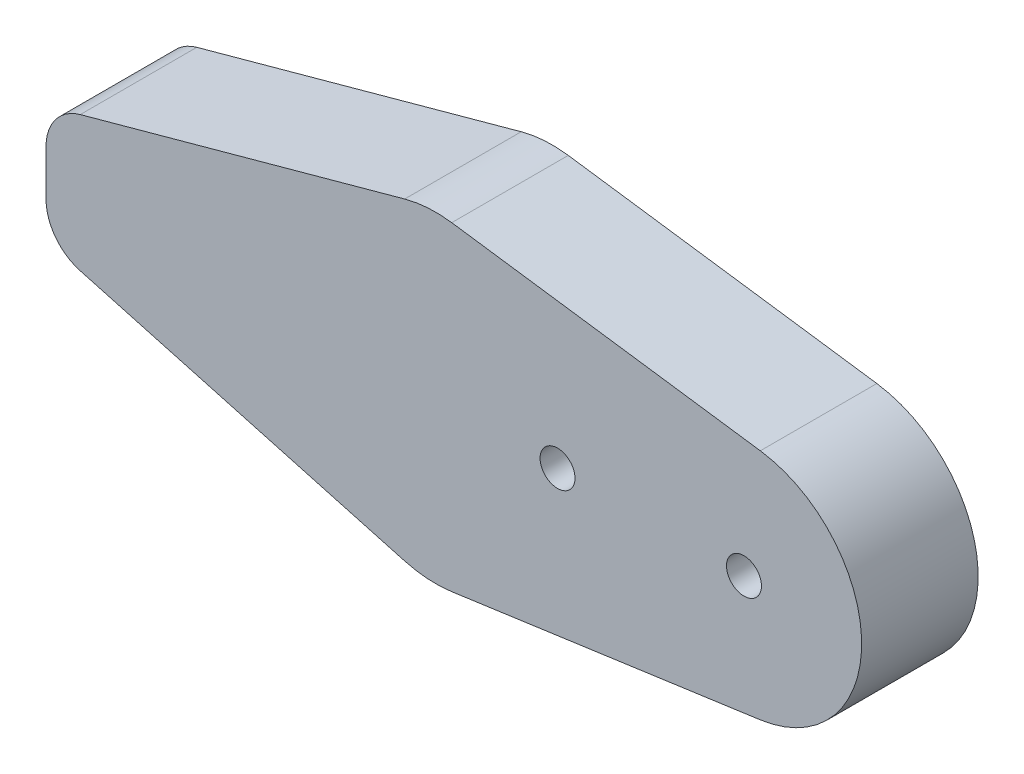
ISO-10303-21;
HEADER;
FILE_DESCRIPTION(('STEP AP214'),'2;1');
FILE_NAME('part.step','',(''),(''),'','','');
FILE_SCHEMA(('AUTOMOTIVE_DESIGN { 1 0 10303 214 1 1 1 1 }'));
ENDSEC;
DATA;
#1=APPLICATION_CONTEXT('core data for automotive mechanical design processes');
#2=APPLICATION_PROTOCOL_DEFINITION('international standard','automotive_design',2000,#1);
#3=PRODUCT_CONTEXT('',#1,'mechanical');
#4=PRODUCT('Part','Part','',(#3));
#5=PRODUCT_RELATED_PRODUCT_CATEGORY('part','',(#4));
#6=PRODUCT_DEFINITION_FORMATION('','',#4);
#7=PRODUCT_DEFINITION_CONTEXT('part definition',#1,'design');
#8=PRODUCT_DEFINITION('design','',#6,#7);
#9=PRODUCT_DEFINITION_SHAPE('','',#8);
#10=(LENGTH_UNIT() NAMED_UNIT(*) SI_UNIT(.MILLI.,.METRE.));
#11=(NAMED_UNIT(*) PLANE_ANGLE_UNIT() SI_UNIT($,.RADIAN.));
#12=(NAMED_UNIT(*) SI_UNIT($,.STERADIAN.) SOLID_ANGLE_UNIT());
#13=UNCERTAINTY_MEASURE_WITH_UNIT(LENGTH_MEASURE(1.E-05),#10,'distance_accuracy_value','');
#14=(GEOMETRIC_REPRESENTATION_CONTEXT(3) GLOBAL_UNCERTAINTY_ASSIGNED_CONTEXT((#13)) GLOBAL_UNIT_ASSIGNED_CONTEXT((#10,
#11,#12)) REPRESENTATION_CONTEXT('',''));
#15=CARTESIAN_POINT('',(0.,0.,0.));
#16=DIRECTION('',(0.,0.,1.));
#17=DIRECTION('',(1.,0.,0.));
#18=AXIS2_PLACEMENT_3D('',#15,#16,#17);
#19=CARTESIAN_POINT('',(18.5921017189423,0.,5.));
#20=DIRECTION('',(0.,0.,-1.));
#21=DIRECTION('',(-1.,0.,0.));
#22=AXIS2_PLACEMENT_3D('',#19,#20,#21);
#23=CYLINDRICAL_SURFACE('',#22,5.04890608443004);
#24=CARTESIAN_POINT('',(18.5921017189423,0.,0.));
#25=DIRECTION('',(0.,0.,1.));
#26=DIRECTION('',(1.,0.,0.));
#27=AXIS2_PLACEMENT_3D('',#24,#25,#26);
#28=CIRCLE('',#27,5.04890608443004);
#29=CARTESIAN_POINT('',(19.2931385577709,-5.,0.));
#30=VERTEX_POINT('',#29);
#31=CARTESIAN_POINT('',(19.2931385577709,5.,0.));
#32=VERTEX_POINT('',#31);
#33=EDGE_CURVE('E158',#30,#32,#28,.T.);
#34=ORIENTED_EDGE('',*,*,#33,.T.);
#35=DIRECTION('',(0.,0.,-1.));
#36=VECTOR('',#35,1.);
#37=CARTESIAN_POINT('',(19.2931385577709,5.,5.));
#38=LINE('',#37,#36);
#39=CARTESIAN_POINT('',(19.2931385577709,5.,5.));
#40=VERTEX_POINT('',#39);
#41=EDGE_CURVE('E11',#40,#32,#38,.T.);
#42=ORIENTED_EDGE('',*,*,#41,.F.);
#43=CARTESIAN_POINT('',(18.5921017189423,0.,5.));
#44=DIRECTION('',(0.,0.,1.));
#45=DIRECTION('',(1.,0.,0.));
#46=AXIS2_PLACEMENT_3D('',#43,#44,#45);
#47=CIRCLE('',#46,5.04890608443004);
#48=CARTESIAN_POINT('',(19.2931385577709,-5.,5.));
#49=VERTEX_POINT('',#48);
#50=EDGE_CURVE('E178',#49,#40,#47,.T.);
#51=ORIENTED_EDGE('',*,*,#50,.F.);
#52=DIRECTION('',(0.,0.,-1.));
#53=VECTOR('',#52,1.);
#54=CARTESIAN_POINT('',(19.2931385577709,-5.,5.));
#55=LINE('',#54,#53);
#56=EDGE_CURVE('E154',#49,#30,#55,.T.);
#57=ORIENTED_EDGE('',*,*,#56,.T.);
#58=EDGE_LOOP('',(#34,#42,#51,#57));
#59=FACE_BOUND('',#58,.T.);
#60=ADVANCED_FACE('F36',(#59),#23,.T.);
#61=CARTESIAN_POINT('',(6.05109589484435,6.85663194561017,5.));
#62=DIRECTION('',(-0.138849253106614,-0.990313528591696,0.));
#63=DIRECTION('',(0.990313528591696,-0.138849253106614,0.));
#64=AXIS2_PLACEMENT_3D('',#61,#62,#63);
#65=PLANE('',#64);
#66=DIRECTION('',(-0.990313528591696,0.138849253106614,0.));
#67=VECTOR('',#66,1.);
#68=CARTESIAN_POINT('',(6.05109589484435,6.85663194561017,0.));
#69=LINE('',#68,#67);
#70=CARTESIAN_POINT('',(6.05109589484435,6.85663194561017,0.));
#71=VERTEX_POINT('',#70);
#72=EDGE_CURVE('E161',#32,#71,#69,.T.);
#73=ORIENTED_EDGE('',*,*,#72,.T.);
#74=DIRECTION('',(0.,0.,-1.));
#75=VECTOR('',#74,1.);
#76=CARTESIAN_POINT('',(6.05109589484435,6.85663194561017,5.));
#77=LINE('',#76,#75);
#78=CARTESIAN_POINT('',(6.05109589484435,6.85663194561017,5.));
#79=VERTEX_POINT('',#78);
#80=EDGE_CURVE('E44',#79,#71,#77,.T.);
#81=ORIENTED_EDGE('',*,*,#80,.F.);
#82=DIRECTION('',(-0.990313528591696,0.138849253106614,0.));
#83=VECTOR('',#82,1.);
#84=CARTESIAN_POINT('',(6.05109589484435,6.85663194561017,5.));
#85=LINE('',#84,#83);
#86=EDGE_CURVE('E108',#40,#79,#85,.T.);
#87=ORIENTED_EDGE('',*,*,#86,.F.);
#88=ORIENTED_EDGE('',*,*,#41,.T.);
#89=EDGE_LOOP('',(#73,#81,#87,#88));
#90=FACE_BOUND('',#89,.T.);
#91=ADVANCED_FACE('F268',(#90),#65,.F.);
#92=CARTESIAN_POINT('',(5.35684962931128,1.90506430265169,5.));
#93=DIRECTION('',(0.,0.,-1.));
#94=DIRECTION('',(-1.,0.,0.));
#95=AXIS2_PLACEMENT_3D('',#92,#93,#94);
#96=CYLINDRICAL_SURFACE('',#95,5.);
#97=CARTESIAN_POINT('',(5.35684962931128,1.90506430265169,0.));
#98=DIRECTION('',(0.,0.,1.));
#99=DIRECTION('',(-1.,0.,0.));
#100=AXIS2_PLACEMENT_3D('',#97,#98,#99);
#101=CIRCLE('',#100,5.);
#102=CARTESIAN_POINT('',(4.03286576113956,6.72658550625757,0.));
#103=VERTEX_POINT('',#102);
#104=EDGE_CURVE('E164',#71,#103,#101,.T.);
#105=ORIENTED_EDGE('',*,*,#104,.T.);
#106=DIRECTION('',(0.,0.,-1.));
#107=VECTOR('',#106,1.);
#108=CARTESIAN_POINT('',(4.03286576113956,6.72658550625757,5.));
#109=LINE('',#108,#107);
#110=CARTESIAN_POINT('',(4.03286576113956,6.72658550625757,5.));
#111=VERTEX_POINT('',#110);
#112=EDGE_CURVE('E191',#111,#103,#109,.T.);
#113=ORIENTED_EDGE('',*,*,#112,.F.);
#114=CARTESIAN_POINT('',(5.35684962931128,1.90506430265169,5.));
#115=DIRECTION('',(0.,0.,1.));
#116=DIRECTION('',(-1.,0.,0.));
#117=AXIS2_PLACEMENT_3D('',#114,#115,#116);
#118=CIRCLE('',#117,5.);
#119=EDGE_CURVE('E242',#79,#111,#118,.T.);
#120=ORIENTED_EDGE('',*,*,#119,.F.);
#121=ORIENTED_EDGE('',*,*,#80,.T.);
#122=EDGE_LOOP('',(#105,#113,#120,#121));
#123=FACE_BOUND('',#122,.T.);
#124=ADVANCED_FACE('F271',(#123),#96,.T.);
#125=CARTESIAN_POINT('',(-9.88858574389631,2.90377182653804,5.));
#126=DIRECTION('',(0.264796773634343,-0.964304240721175,0.));
#127=DIRECTION('',(0.964304240721175,0.264796773634343,0.));
#128=AXIS2_PLACEMENT_3D('',#125,#126,#127);
#129=PLANE('',#128);
#130=DIRECTION('',(-0.964304240721175,-0.264796773634343,0.));
#131=VECTOR('',#130,1.);
#132=CARTESIAN_POINT('',(-9.88858574389631,2.90377182653804,0.));
#133=LINE('',#132,#131);
#134=CARTESIAN_POINT('',(-9.88858574389631,2.90377182653804,0.));
#135=VERTEX_POINT('',#134);
#136=EDGE_CURVE('E166',#103,#135,#133,.T.);
#137=ORIENTED_EDGE('',*,*,#136,.T.);
#138=DIRECTION('',(0.,0.,-1.));
#139=VECTOR('',#138,1.);
#140=CARTESIAN_POINT('',(-9.88858574389631,2.90377182653804,5.));
#141=LINE('',#140,#139);
#142=CARTESIAN_POINT('',(-9.88858574389631,2.90377182653804,5.));
#143=VERTEX_POINT('',#142);
#144=EDGE_CURVE('E188',#143,#135,#141,.T.);
#145=ORIENTED_EDGE('',*,*,#144,.F.);
#146=DIRECTION('',(-0.964304240721175,-0.264796773634343,0.));
#147=VECTOR('',#146,1.);
#148=CARTESIAN_POINT('',(-9.88858574389631,2.90377182653804,5.));
#149=LINE('',#148,#147);
#150=EDGE_CURVE('E244',#111,#143,#149,.T.);
#151=ORIENTED_EDGE('',*,*,#150,.F.);
#152=ORIENTED_EDGE('',*,*,#112,.T.);
#153=EDGE_LOOP('',(#137,#145,#151,#152));
#154=FACE_BOUND('',#153,.T.);
#155=ADVANCED_FACE('F276',(#154),#129,.F.);
#156=CARTESIAN_POINT('',(-9.35899219662762,0.975163345095687,5.));
#157=DIRECTION('',(0.,0.,-1.));
#158=DIRECTION('',(-1.,0.,0.));
#159=AXIS2_PLACEMENT_3D('',#156,#157,#158);
#160=CYLINDRICAL_SURFACE('',#159,2.);
#161=CARTESIAN_POINT('',(-9.35899219662762,0.975163345095687,0.));
#162=DIRECTION('',(0.,0.,1.));
#163=DIRECTION('',(-1.,0.,0.));
#164=AXIS2_PLACEMENT_3D('',#161,#162,#163);
#165=CIRCLE('',#164,2.);
#166=CARTESIAN_POINT('',(-11.3589921966276,0.975163345095687,0.));
#167=VERTEX_POINT('',#166);
#168=EDGE_CURVE('E168',#135,#167,#165,.T.);
#169=ORIENTED_EDGE('',*,*,#168,.T.);
#170=DIRECTION('',(0.,0.,-1.));
#171=VECTOR('',#170,1.);
#172=CARTESIAN_POINT('',(-11.3589921966276,0.975163345095687,5.));
#173=LINE('',#172,#171);
#174=CARTESIAN_POINT('',(-11.3589921966276,0.975163345095687,5.));
#175=VERTEX_POINT('',#174);
#176=EDGE_CURVE('E185',#175,#167,#173,.T.);
#177=ORIENTED_EDGE('',*,*,#176,.F.);
#178=CARTESIAN_POINT('',(-9.35899219662762,0.975163345095687,5.));
#179=DIRECTION('',(0.,0.,1.));
#180=DIRECTION('',(-1.,0.,0.));
#181=AXIS2_PLACEMENT_3D('',#178,#179,#180);
#182=CIRCLE('',#181,2.);
#183=EDGE_CURVE('E246',#143,#175,#182,.T.);
#184=ORIENTED_EDGE('',*,*,#183,.F.);
#185=ORIENTED_EDGE('',*,*,#144,.T.);
#186=EDGE_LOOP('',(#169,#177,#184,#185));
#187=FACE_BOUND('',#186,.T.);
#188=ADVANCED_FACE('F279',(#187),#160,.T.);
#189=CARTESIAN_POINT('',(-11.3589921966276,-0.975163345095687,5.));
#190=DIRECTION('',(1.,0.,0.));
#191=DIRECTION('',(0.,0.,-1.));
#192=AXIS2_PLACEMENT_3D('',#189,#190,#191);
#193=PLANE('',#192);
#194=CARTESIAN_POINT('',(-11.3589921966276,0.00496564635896147,3.));
#195=DIRECTION('',(-1.,0.,0.));
#196=DIRECTION('',(0.,0.,1.));
#197=AXIS2_PLACEMENT_3D('',#194,#195,#196);
#198=CIRCLE('',#197,0.75);
#199=CARTESIAN_POINT('',(-11.3589921966276,-0.745034353641038,3.));
#200=VERTEX_POINT('',#199);
#201=CARTESIAN_POINT('',(-11.3589921966276,0.754965646358961,3.));
#202=VERTEX_POINT('',#201);
#203=EDGE_CURVE('E224',#200,#202,#198,.T.);
#204=ORIENTED_EDGE('',*,*,#203,.F.);
#205=DIRECTION('',(0.,0.,1.));
#206=VECTOR('',#205,1.);
#207=CARTESIAN_POINT('',(-11.3589921966276,-0.745034353641038,3.));
#208=LINE('',#207,#206);
#209=CARTESIAN_POINT('',(-11.3589921966276,-0.745034353641039,1.));
#210=VERTEX_POINT('',#209);
#211=EDGE_CURVE('E52',#210,#200,#208,.T.);
#212=ORIENTED_EDGE('',*,*,#211,.F.);
#213=DIRECTION('',(0.,-1.,0.));
#214=VECTOR('',#213,1.);
#215=CARTESIAN_POINT('',(-11.3589921966276,-0.745034353641039,1.));
#216=LINE('',#215,#214);
#217=CARTESIAN_POINT('',(-11.3589921966276,0.754965646358961,1.));
#218=VERTEX_POINT('',#217);
#219=EDGE_CURVE('E213',#218,#210,#216,.T.);
#220=ORIENTED_EDGE('',*,*,#219,.F.);
#221=DIRECTION('',(0.,0.,-1.));
#222=VECTOR('',#221,1.);
#223=CARTESIAN_POINT('',(-11.3589921966276,0.754965646358961,1.));
#224=LINE('',#223,#222);
#225=EDGE_CURVE('E227',#202,#218,#224,.T.);
#226=ORIENTED_EDGE('',*,*,#225,.F.);
#227=EDGE_LOOP('',(#204,#212,#220,#226));
#228=FACE_BOUND('',#227,.T.);
#229=DIRECTION('',(0.,-1.,0.));
#230=VECTOR('',#229,1.);
#231=CARTESIAN_POINT('',(-11.3589921966276,-0.975163345095687,0.));
#232=LINE('',#231,#230);
#233=CARTESIAN_POINT('',(-11.3589921966276,-0.975163345095687,0.));
#234=VERTEX_POINT('',#233);
#235=EDGE_CURVE('E170',#167,#234,#232,.T.);
#236=ORIENTED_EDGE('',*,*,#235,.T.);
#237=DIRECTION('',(0.,0.,-1.));
#238=VECTOR('',#237,1.);
#239=CARTESIAN_POINT('',(-11.3589921966276,-0.975163345095687,5.));
#240=LINE('',#239,#238);
#241=CARTESIAN_POINT('',(-11.3589921966276,-0.975163345095687,5.));
#242=VERTEX_POINT('',#241);
#243=EDGE_CURVE('E182',#242,#234,#240,.T.);
#244=ORIENTED_EDGE('',*,*,#243,.F.);
#245=DIRECTION('',(0.,-1.,0.));
#246=VECTOR('',#245,1.);
#247=CARTESIAN_POINT('',(-11.3589921966276,-0.975163345095687,5.));
#248=LINE('',#247,#246);
#249=EDGE_CURVE('E248',#175,#242,#248,.T.);
#250=ORIENTED_EDGE('',*,*,#249,.F.);
#251=ORIENTED_EDGE('',*,*,#176,.T.);
#252=EDGE_LOOP('',(#236,#244,#250,#251));
#253=FACE_BOUND('',#252,.T.);
#254=ADVANCED_FACE('F254',(#228,#253),#193,.F.);
#255=CARTESIAN_POINT('',(-9.35899219662762,-0.975163345095687,5.));
#256=DIRECTION('',(0.,0.,-1.));
#257=DIRECTION('',(-1.,0.,0.));
#258=AXIS2_PLACEMENT_3D('',#255,#256,#257);
#259=CYLINDRICAL_SURFACE('',#258,2.);
#260=CARTESIAN_POINT('',(-9.35899219662762,-0.975163345095687,0.));
#261=DIRECTION('',(0.,0.,1.));
#262=DIRECTION('',(-1.,0.,0.));
#263=AXIS2_PLACEMENT_3D('',#260,#261,#262);
#264=CIRCLE('',#263,2.);
#265=CARTESIAN_POINT('',(-9.88858574389631,-2.90377182653804,0.));
#266=VERTEX_POINT('',#265);
#267=EDGE_CURVE('E172',#234,#266,#264,.T.);
#268=ORIENTED_EDGE('',*,*,#267,.T.);
#269=DIRECTION('',(0.,0.,-1.));
#270=VECTOR('',#269,1.);
#271=CARTESIAN_POINT('',(-9.88858574389631,-2.90377182653804,5.));
#272=LINE('',#271,#270);
#273=CARTESIAN_POINT('',(-9.88858574389631,-2.90377182653804,5.));
#274=VERTEX_POINT('',#273);
#275=EDGE_CURVE('E149',#274,#266,#272,.T.);
#276=ORIENTED_EDGE('',*,*,#275,.F.);
#277=CARTESIAN_POINT('',(-9.35899219662762,-0.975163345095687,5.));
#278=DIRECTION('',(0.,0.,1.));
#279=DIRECTION('',(-1.,0.,0.));
#280=AXIS2_PLACEMENT_3D('',#277,#278,#279);
#281=CIRCLE('',#280,2.);
#282=EDGE_CURVE('E137',#242,#274,#281,.T.);
#283=ORIENTED_EDGE('',*,*,#282,.F.);
#284=ORIENTED_EDGE('',*,*,#243,.T.);
#285=EDGE_LOOP('',(#268,#276,#283,#284));
#286=FACE_BOUND('',#285,.T.);
#287=ADVANCED_FACE('F258',(#286),#259,.T.);
#288=CARTESIAN_POINT('',(-9.88858574389631,-2.90377182653804,5.));
#289=DIRECTION('',(0.264796773634343,0.964304240721175,0.));
#290=DIRECTION('',(-0.964304240721175,0.264796773634343,0.));
#291=AXIS2_PLACEMENT_3D('',#288,#289,#290);
#292=PLANE('',#291);
#293=DIRECTION('',(0.964304240721175,-0.264796773634343,0.));
#294=VECTOR('',#293,1.);
#295=CARTESIAN_POINT('',(-9.88858574389631,-2.90377182653804,0.));
#296=LINE('',#295,#294);
#297=CARTESIAN_POINT('',(4.03286576113956,-6.72658550625757,0.));
#298=VERTEX_POINT('',#297);
#299=EDGE_CURVE('E146',#266,#298,#296,.T.);
#300=ORIENTED_EDGE('',*,*,#299,.T.);
#301=DIRECTION('',(0.,0.,-1.));
#302=VECTOR('',#301,1.);
#303=CARTESIAN_POINT('',(4.03286576113956,-6.72658550625757,5.));
#304=LINE('',#303,#302);
#305=CARTESIAN_POINT('',(4.03286576113956,-6.72658550625757,5.));
#306=VERTEX_POINT('',#305);
#307=EDGE_CURVE('E143',#306,#298,#304,.T.);
#308=ORIENTED_EDGE('',*,*,#307,.F.);
#309=DIRECTION('',(0.964304240721175,-0.264796773634343,0.));
#310=VECTOR('',#309,1.);
#311=CARTESIAN_POINT('',(-9.88858574389631,-2.90377182653804,5.));
#312=LINE('',#311,#310);
#313=EDGE_CURVE('E130',#274,#306,#312,.T.);
#314=ORIENTED_EDGE('',*,*,#313,.F.);
#315=ORIENTED_EDGE('',*,*,#275,.T.);
#316=EDGE_LOOP('',(#300,#308,#314,#315));
#317=FACE_BOUND('',#316,.T.);
#318=ADVANCED_FACE('F144',(#317),#292,.F.);
#319=CARTESIAN_POINT('',(5.35684962931128,-1.90506430265169,5.));
#320=DIRECTION('',(0.,0.,-1.));
#321=DIRECTION('',(-1.,0.,0.));
#322=AXIS2_PLACEMENT_3D('',#319,#320,#321);
#323=CYLINDRICAL_SURFACE('',#322,5.);
#324=CARTESIAN_POINT('',(5.35684962931128,-1.90506430265169,0.));
#325=DIRECTION('',(0.,0.,1.));
#326=DIRECTION('',(-1.,0.,0.));
#327=AXIS2_PLACEMENT_3D('',#324,#325,#326);
#328=CIRCLE('',#327,5.);
#329=CARTESIAN_POINT('',(6.05109589484435,-6.85663194561017,0.));
#330=VERTEX_POINT('',#329);
#331=EDGE_CURVE('E175',#298,#330,#328,.T.);
#332=ORIENTED_EDGE('',*,*,#331,.T.);
#333=DIRECTION('',(0.,0.,-1.));
#334=VECTOR('',#333,1.);
#335=CARTESIAN_POINT('',(6.05109589484435,-6.85663194561017,5.));
#336=LINE('',#335,#334);
#337=CARTESIAN_POINT('',(6.05109589484435,-6.85663194561017,5.));
#338=VERTEX_POINT('',#337);
#339=EDGE_CURVE('E150',#338,#330,#336,.T.);
#340=ORIENTED_EDGE('',*,*,#339,.F.);
#341=CARTESIAN_POINT('',(5.35684962931128,-1.90506430265169,5.));
#342=DIRECTION('',(0.,0.,1.));
#343=DIRECTION('',(-1.,0.,0.));
#344=AXIS2_PLACEMENT_3D('',#341,#342,#343);
#345=CIRCLE('',#344,5.);
#346=EDGE_CURVE('E134',#306,#338,#345,.T.);
#347=ORIENTED_EDGE('',*,*,#346,.F.);
#348=ORIENTED_EDGE('',*,*,#307,.T.);
#349=EDGE_LOOP('',(#332,#340,#347,#348));
#350=FACE_BOUND('',#349,.T.);
#351=ADVANCED_FACE('F152',(#350),#323,.T.);
#352=CARTESIAN_POINT('',(6.05109589484435,-6.85663194561017,5.));
#353=DIRECTION('',(-0.138849253106614,0.990313528591696,0.));
#354=DIRECTION('',(-0.990313528591696,-0.138849253106614,0.));
#355=AXIS2_PLACEMENT_3D('',#352,#353,#354);
#356=PLANE('',#355);
#357=DIRECTION('',(0.990313528591696,0.138849253106614,0.));
#358=VECTOR('',#357,1.);
#359=CARTESIAN_POINT('',(6.05109589484435,-6.85663194561017,0.));
#360=LINE('',#359,#358);
#361=EDGE_CURVE('E100',#330,#30,#360,.T.);
#362=ORIENTED_EDGE('',*,*,#361,.T.);
#363=ORIENTED_EDGE('',*,*,#56,.F.);
#364=DIRECTION('',(0.990313528591696,0.138849253106614,0.));
#365=VECTOR('',#364,1.);
#366=CARTESIAN_POINT('',(6.05109589484435,-6.85663194561017,5.));
#367=LINE('',#366,#365);
#368=EDGE_CURVE('E61',#338,#49,#367,.T.);
#369=ORIENTED_EDGE('',*,*,#368,.F.);
#370=ORIENTED_EDGE('',*,*,#339,.T.);
#371=EDGE_LOOP('',(#362,#363,#369,#370));
#372=FACE_BOUND('',#371,.T.);
#373=ADVANCED_FACE('F262',(#372),#356,.F.);
#374=CARTESIAN_POINT('',(18.5921017189423,0.,5.));
#375=DIRECTION('',(0.,0.,1.));
#376=DIRECTION('',(1.,0.,0.));
#377=AXIS2_PLACEMENT_3D('',#374,#375,#376);
#378=PLANE('',#377);
#379=CARTESIAN_POINT('',(18.5921017189423,0.,5.));
#380=DIRECTION('',(0.,0.,1.));
#381=DIRECTION('',(1.,0.,0.));
#382=AXIS2_PLACEMENT_3D('',#379,#380,#381);
#383=CIRCLE('',#382,0.750000000000002);
#384=CARTESIAN_POINT('',(19.3421017189423,0.,5.));
#385=VERTEX_POINT('',#384);
#386=EDGE_CURVE('E197',#385,#385,#383,.T.);
#387=ORIENTED_EDGE('',*,*,#386,.F.);
#388=EDGE_LOOP('',(#387));
#389=FACE_BOUND('',#388,.T.);
#390=CARTESIAN_POINT('',(10.5921017189423,0.,5.));
#391=DIRECTION('',(0.,0.,1.));
#392=DIRECTION('',(1.,0.,0.));
#393=AXIS2_PLACEMENT_3D('',#390,#391,#392);
#394=CIRCLE('',#393,0.75);
#395=CARTESIAN_POINT('',(11.3421017189423,0.,5.));
#396=VERTEX_POINT('',#395);
#397=EDGE_CURVE('E202',#396,#396,#394,.T.);
#398=ORIENTED_EDGE('',*,*,#397,.F.);
#399=EDGE_LOOP('',(#398));
#400=FACE_BOUND('',#399,.T.);
#401=ORIENTED_EDGE('',*,*,#50,.T.);
#402=ORIENTED_EDGE('',*,*,#86,.T.);
#403=ORIENTED_EDGE('',*,*,#119,.T.);
#404=ORIENTED_EDGE('',*,*,#150,.T.);
#405=ORIENTED_EDGE('',*,*,#183,.T.);
#406=ORIENTED_EDGE('',*,*,#249,.T.);
#407=ORIENTED_EDGE('',*,*,#282,.T.);
#408=ORIENTED_EDGE('',*,*,#313,.T.);
#409=ORIENTED_EDGE('',*,*,#346,.T.);
#410=ORIENTED_EDGE('',*,*,#368,.T.);
#411=EDGE_LOOP('',(#401,#402,#403,#404,#405,#406,#407,#408,#409,#410));
#412=FACE_BOUND('',#411,.T.);
#413=ADVANCED_FACE('F132',(#389,#400,#412),#378,.T.);
#414=CARTESIAN_POINT('',(18.5921017189423,0.,0.));
#415=DIRECTION('',(0.,0.,1.));
#416=DIRECTION('',(1.,0.,0.));
#417=AXIS2_PLACEMENT_3D('',#414,#415,#416);
#418=PLANE('',#417);
#419=CARTESIAN_POINT('',(18.5921017189423,0.,0.));
#420=DIRECTION('',(0.,0.,1.));
#421=DIRECTION('',(1.,0.,0.));
#422=AXIS2_PLACEMENT_3D('',#419,#420,#421);
#423=CIRCLE('',#422,0.750000000000002);
#424=CARTESIAN_POINT('',(19.3421017189423,0.,0.));
#425=VERTEX_POINT('',#424);
#426=EDGE_CURVE('E39',#425,#425,#423,.T.);
#427=ORIENTED_EDGE('',*,*,#426,.T.);
#428=EDGE_LOOP('',(#427));
#429=FACE_BOUND('',#428,.T.);
#430=CARTESIAN_POINT('',(10.5921017189423,0.,0.));
#431=DIRECTION('',(0.,0.,1.));
#432=DIRECTION('',(1.,0.,0.));
#433=AXIS2_PLACEMENT_3D('',#430,#431,#432);
#434=CIRCLE('',#433,0.75);
#435=CARTESIAN_POINT('',(11.3421017189423,0.,0.));
#436=VERTEX_POINT('',#435);
#437=EDGE_CURVE('E195',#436,#436,#434,.T.);
#438=ORIENTED_EDGE('',*,*,#437,.T.);
#439=EDGE_LOOP('',(#438));
#440=FACE_BOUND('',#439,.T.);
#441=ORIENTED_EDGE('',*,*,#33,.F.);
#442=ORIENTED_EDGE('',*,*,#361,.F.);
#443=ORIENTED_EDGE('',*,*,#331,.F.);
#444=ORIENTED_EDGE('',*,*,#299,.F.);
#445=ORIENTED_EDGE('',*,*,#267,.F.);
#446=ORIENTED_EDGE('',*,*,#235,.F.);
#447=ORIENTED_EDGE('',*,*,#168,.F.);
#448=ORIENTED_EDGE('',*,*,#136,.F.);
#449=ORIENTED_EDGE('',*,*,#104,.F.);
#450=ORIENTED_EDGE('',*,*,#72,.F.);
#451=EDGE_LOOP('',(#441,#442,#443,#444,#445,#446,#447,#448,#449,#450));
#452=FACE_BOUND('',#451,.T.);
#453=ADVANCED_FACE('F261',(#429,#440,#452),#418,.F.);
#454=CARTESIAN_POINT('',(4.64100780337238,-0.745034353641038,3.));
#455=DIRECTION('',(0.,-1.,0.));
#456=DIRECTION('',(0.,0.,-1.));
#457=AXIS2_PLACEMENT_3D('',#454,#455,#456);
#458=PLANE('',#457);
#459=ORIENTED_EDGE('',*,*,#211,.T.);
#460=DIRECTION('',(-1.,0.,0.));
#461=VECTOR('',#460,1.);
#462=CARTESIAN_POINT('',(4.64100780337238,-0.745034353641038,3.));
#463=LINE('',#462,#461);
#464=CARTESIAN_POINT('',(4.64100780337238,-0.745034353641038,3.));
#465=VERTEX_POINT('',#464);
#466=EDGE_CURVE('E222',#465,#200,#463,.T.);
#467=ORIENTED_EDGE('',*,*,#466,.F.);
#468=DIRECTION('',(0.,0.,1.));
#469=VECTOR('',#468,1.);
#470=CARTESIAN_POINT('',(4.64100780337238,-0.745034353641038,3.));
#471=LINE('',#470,#469);
#472=CARTESIAN_POINT('',(4.64100780337238,-0.745034353641039,1.));
#473=VERTEX_POINT('',#472);
#474=EDGE_CURVE('E209',#473,#465,#471,.T.);
#475=ORIENTED_EDGE('',*,*,#474,.F.);
#476=DIRECTION('',(-1.,0.,0.));
#477=VECTOR('',#476,1.);
#478=CARTESIAN_POINT('',(4.64100780337238,-0.745034353641039,1.));
#479=LINE('',#478,#477);
#480=EDGE_CURVE('E162',#473,#210,#479,.T.);
#481=ORIENTED_EDGE('',*,*,#480,.T.);
#482=EDGE_LOOP('',(#459,#467,#475,#481));
#483=FACE_BOUND('',#482,.T.);
#484=ADVANCED_FACE('F352',(#483),#458,.F.);
#485=CARTESIAN_POINT('',(4.64100780337238,-0.745034353641039,1.));
#486=DIRECTION('',(0.,0.,-1.));
#487=DIRECTION('',(-1.,0.,0.));
#488=AXIS2_PLACEMENT_3D('',#485,#486,#487);
#489=PLANE('',#488);
#490=ORIENTED_EDGE('',*,*,#219,.T.);
#491=ORIENTED_EDGE('',*,*,#480,.F.);
#492=DIRECTION('',(0.,-1.,0.));
#493=VECTOR('',#492,1.);
#494=CARTESIAN_POINT('',(4.64100780337238,-0.745034353641039,1.));
#495=LINE('',#494,#493);
#496=CARTESIAN_POINT('',(4.64100780337238,0.754965646358961,1.));
#497=VERTEX_POINT('',#496);
#498=EDGE_CURVE('E219',#497,#473,#495,.T.);
#499=ORIENTED_EDGE('',*,*,#498,.F.);
#500=DIRECTION('',(-1.,0.,0.));
#501=VECTOR('',#500,1.);
#502=CARTESIAN_POINT('',(4.64100780337238,0.754965646358961,1.));
#503=LINE('',#502,#501);
#504=EDGE_CURVE('E233',#497,#218,#503,.T.);
#505=ORIENTED_EDGE('',*,*,#504,.T.);
#506=EDGE_LOOP('',(#490,#491,#499,#505));
#507=FACE_BOUND('',#506,.T.);
#508=ADVANCED_FACE('F357',(#507),#489,.F.);
#509=CARTESIAN_POINT('',(4.64100780337238,0.754965646358961,1.));
#510=DIRECTION('',(0.,1.,0.));
#511=DIRECTION('',(0.,0.,1.));
#512=AXIS2_PLACEMENT_3D('',#509,#510,#511);
#513=PLANE('',#512);
#514=ORIENTED_EDGE('',*,*,#225,.T.);
#515=ORIENTED_EDGE('',*,*,#504,.F.);
#516=DIRECTION('',(0.,0.,-1.));
#517=VECTOR('',#516,1.);
#518=CARTESIAN_POINT('',(4.64100780337238,0.754965646358961,1.));
#519=LINE('',#518,#517);
#520=CARTESIAN_POINT('',(4.64100780337238,0.754965646358961,3.));
#521=VERTEX_POINT('',#520);
#522=EDGE_CURVE('E216',#521,#497,#519,.T.);
#523=ORIENTED_EDGE('',*,*,#522,.F.);
#524=DIRECTION('',(-1.,0.,0.));
#525=VECTOR('',#524,1.);
#526=CARTESIAN_POINT('',(4.64100780337238,0.754965646358961,3.));
#527=LINE('',#526,#525);
#528=EDGE_CURVE('E236',#521,#202,#527,.T.);
#529=ORIENTED_EDGE('',*,*,#528,.T.);
#530=EDGE_LOOP('',(#514,#515,#523,#529));
#531=FACE_BOUND('',#530,.T.);
#532=ADVANCED_FACE('F368',(#531),#513,.F.);
#533=CARTESIAN_POINT('',(4.64100780337238,0.00496564635896147,3.));
#534=DIRECTION('',(-1.,0.,0.));
#535=DIRECTION('',(0.,0.,1.));
#536=AXIS2_PLACEMENT_3D('',#533,#534,#535);
#537=CYLINDRICAL_SURFACE('',#536,0.75);
#538=ORIENTED_EDGE('',*,*,#203,.T.);
#539=ORIENTED_EDGE('',*,*,#528,.F.);
#540=CARTESIAN_POINT('',(4.64100780337238,0.00496564635896147,3.));
#541=DIRECTION('',(-1.,0.,0.));
#542=DIRECTION('',(0.,0.,1.));
#543=AXIS2_PLACEMENT_3D('',#540,#541,#542);
#544=CIRCLE('',#543,0.75);
#545=EDGE_CURVE('E212',#465,#521,#544,.T.);
#546=ORIENTED_EDGE('',*,*,#545,.F.);
#547=ORIENTED_EDGE('',*,*,#466,.T.);
#548=EDGE_LOOP('',(#538,#539,#546,#547));
#549=FACE_BOUND('',#548,.T.);
#550=ADVANCED_FACE('F378',(#549),#537,.F.);
#551=CARTESIAN_POINT('',(4.64100780337238,0.00496564635896147,3.));
#552=DIRECTION('',(-1.,0.,0.));
#553=DIRECTION('',(0.,0.,1.));
#554=AXIS2_PLACEMENT_3D('',#551,#552,#553);
#555=PLANE('',#554);
#556=ORIENTED_EDGE('',*,*,#474,.T.);
#557=ORIENTED_EDGE('',*,*,#545,.T.);
#558=ORIENTED_EDGE('',*,*,#522,.T.);
#559=ORIENTED_EDGE('',*,*,#498,.T.);
#560=EDGE_LOOP('',(#556,#557,#558,#559));
#561=FACE_BOUND('',#560,.T.);
#562=ADVANCED_FACE('F388',(#561),#555,.T.);
#563=CARTESIAN_POINT('',(10.5921017189423,0.,-3.));
#564=DIRECTION('',(0.,0.,1.));
#565=DIRECTION('',(1.,0.,0.));
#566=AXIS2_PLACEMENT_3D('',#563,#564,#565);
#567=CYLINDRICAL_SURFACE('',#566,0.75);
#568=ORIENTED_EDGE('',*,*,#397,.T.);
#569=EDGE_LOOP('',(#568));
#570=FACE_BOUND('',#569,.T.);
#571=ORIENTED_EDGE('',*,*,#437,.F.);
#572=EDGE_LOOP('',(#571));
#573=FACE_BOUND('',#572,.T.);
#574=ADVANCED_FACE('F398',(#570,#573),#567,.F.);
#575=CARTESIAN_POINT('',(18.5921017189423,0.,-3.));
#576=DIRECTION('',(0.,0.,1.));
#577=DIRECTION('',(1.,0.,0.));
#578=AXIS2_PLACEMENT_3D('',#575,#576,#577);
#579=CYLINDRICAL_SURFACE('',#578,0.750000000000002);
#580=ORIENTED_EDGE('',*,*,#386,.T.);
#581=EDGE_LOOP('',(#580));
#582=FACE_BOUND('',#581,.T.);
#583=ORIENTED_EDGE('',*,*,#426,.F.);
#584=EDGE_LOOP('',(#583));
#585=FACE_BOUND('',#584,.T.);
#586=ADVANCED_FACE('F422',(#582,#585),#579,.F.);
#587=CLOSED_SHELL('',(#60,#91,#124,#155,#188,#254,#287,#318,#351,#373,#413,#453,#484,#508,#532,
#550,#562,#574,#586));
#588=MANIFOLD_SOLID_BREP('B2',#587);
#589=ADVANCED_BREP_SHAPE_REPRESENTATION('',(#18,#588),#14);
#590=SHAPE_DEFINITION_REPRESENTATION(#9,#589);
ENDSEC;
END-ISO-10303-21;
